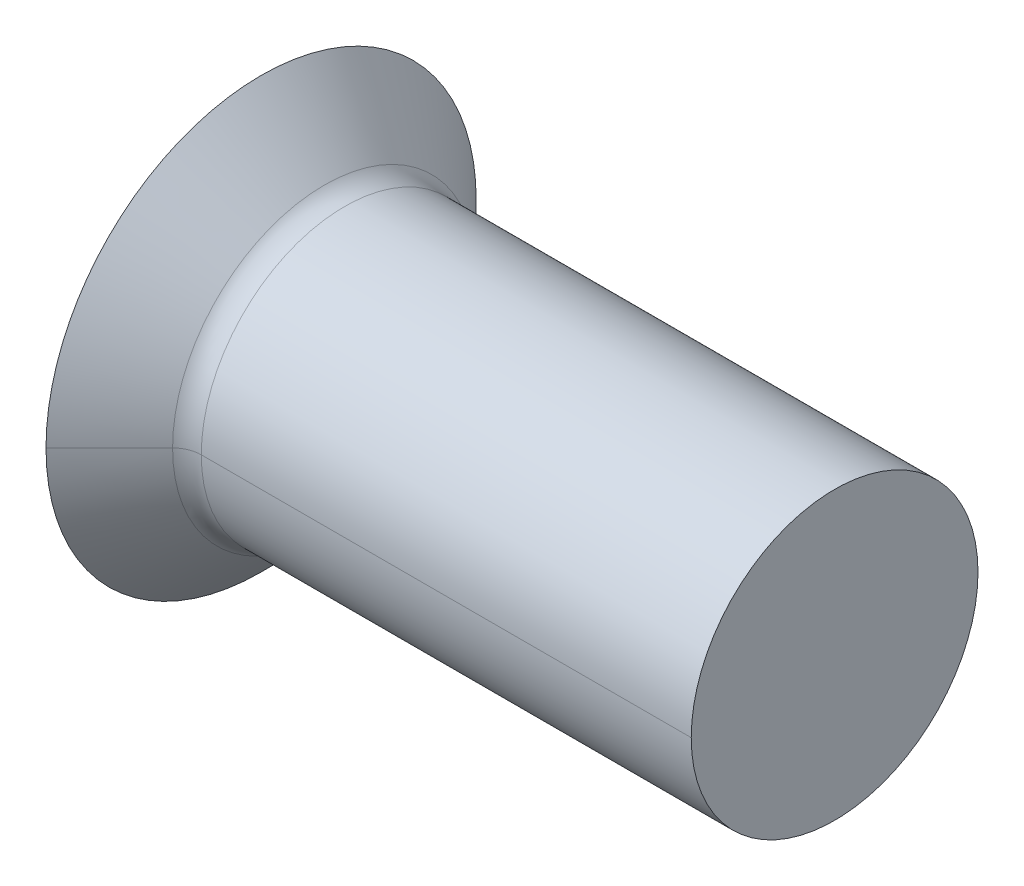
ISO-10303-21;
HEADER;
FILE_DESCRIPTION(('STEP AP214'),'2;1');
FILE_NAME('part.step','',(''),(''),'','','');
FILE_SCHEMA(('AUTOMOTIVE_DESIGN { 1 0 10303 214 1 1 1 1 }'));
ENDSEC;
DATA;
#1=APPLICATION_CONTEXT('core data for automotive mechanical design processes');
#2=APPLICATION_PROTOCOL_DEFINITION('international standard','automotive_design',2000,#1);
#3=PRODUCT_CONTEXT('',#1,'mechanical');
#4=PRODUCT('Part','Part','',(#3));
#5=PRODUCT_RELATED_PRODUCT_CATEGORY('part','',(#4));
#6=PRODUCT_DEFINITION_FORMATION('','',#4);
#7=PRODUCT_DEFINITION_CONTEXT('part definition',#1,'design');
#8=PRODUCT_DEFINITION('design','',#6,#7);
#9=PRODUCT_DEFINITION_SHAPE('','',#8);
#10=(LENGTH_UNIT() NAMED_UNIT(*) SI_UNIT(.MILLI.,.METRE.));
#11=(NAMED_UNIT(*) PLANE_ANGLE_UNIT() SI_UNIT($,.RADIAN.));
#12=(NAMED_UNIT(*) SI_UNIT($,.STERADIAN.) SOLID_ANGLE_UNIT());
#13=UNCERTAINTY_MEASURE_WITH_UNIT(LENGTH_MEASURE(1.E-05),#10,'distance_accuracy_value','');
#14=(GEOMETRIC_REPRESENTATION_CONTEXT(3) GLOBAL_UNCERTAINTY_ASSIGNED_CONTEXT((#13)) GLOBAL_UNIT_ASSIGNED_CONTEXT((#10,
#11,#12)) REPRESENTATION_CONTEXT('',''));
#15=CARTESIAN_POINT('',(0.,0.,0.));
#16=DIRECTION('',(0.,0.,1.));
#17=DIRECTION('',(1.,0.,0.));
#18=AXIS2_PLACEMENT_3D('',#15,#16,#17);
#19=CARTESIAN_POINT('',(0.582842712474624,0.,0.));
#20=DIRECTION('',(-1.,0.,0.));
#21=DIRECTION('',(0.,0.,1.));
#22=AXIS2_PLACEMENT_3D('',#19,#20,#21);
#23=TOROIDAL_SURFACE('',#22,1.2,0.2);
#24=CARTESIAN_POINT('',(0.441421356237315,0.,0.));
#25=DIRECTION('',(-1.,0.,0.));
#26=DIRECTION('',(0.,0.,1.));
#27=AXIS2_PLACEMENT_3D('',#24,#25,#26);
#28=CIRCLE('',#27,1.05857864376269);
#29=CARTESIAN_POINT('',(0.441421356237315,0.,-1.05857864376269));
#30=VERTEX_POINT('',#29);
#31=CARTESIAN_POINT('',(0.441421356237315,0.,1.05857864376269));
#32=VERTEX_POINT('',#31);
#33=EDGE_CURVE('E25',#30,#32,#28,.T.);
#34=ORIENTED_EDGE('',*,*,#33,.F.);
#35=CARTESIAN_POINT('',(0.582842712474624,0.,-1.2));
#36=DIRECTION('',(0.,1.,0.));
#37=DIRECTION('',(0.,0.,1.));
#38=AXIS2_PLACEMENT_3D('',#35,#36,#37);
#39=CIRCLE('',#38,0.2);
#40=CARTESIAN_POINT('',(0.582842712474624,0.,-1.));
#41=VERTEX_POINT('',#40);
#42=EDGE_CURVE('E172',#30,#41,#39,.T.);
#43=ORIENTED_EDGE('',*,*,#42,.T.);
#44=CARTESIAN_POINT('',(0.582842712474624,0.,0.));
#45=DIRECTION('',(1.,0.,0.));
#46=DIRECTION('',(0.,0.,1.));
#47=AXIS2_PLACEMENT_3D('',#44,#45,#46);
#48=CIRCLE('',#47,1.);
#49=CARTESIAN_POINT('',(0.582842712474624,0.,1.));
#50=VERTEX_POINT('',#49);
#51=EDGE_CURVE('E260',#50,#41,#48,.T.);
#52=ORIENTED_EDGE('',*,*,#51,.F.);
#53=CARTESIAN_POINT('',(0.582842712474624,0.,1.2));
#54=DIRECTION('',(0.,-1.,0.));
#55=DIRECTION('',(0.,0.,-1.));
#56=AXIS2_PLACEMENT_3D('',#53,#54,#55);
#57=CIRCLE('',#56,0.2);
#58=EDGE_CURVE('E246',#32,#50,#57,.T.);
#59=ORIENTED_EDGE('',*,*,#58,.F.);
#60=EDGE_LOOP('',(#34,#43,#52,#59));
#61=FACE_BOUND('',#60,.T.);
#62=ADVANCED_FACE('F17',(#61),#23,.F.);
#63=CARTESIAN_POINT('',(-6.50645201269087,0.,0.));
#64=DIRECTION('',(-1.,0.,0.));
#65=DIRECTION('',(0.,0.,1.));
#66=AXIS2_PLACEMENT_3D('',#63,#64,#65);
#67=CYLINDRICAL_SURFACE('',#66,1.);
#68=CARTESIAN_POINT('',(4.,0.,0.));
#69=DIRECTION('',(-1.,0.,0.));
#70=DIRECTION('',(0.,0.,1.));
#71=AXIS2_PLACEMENT_3D('',#68,#69,#70);
#72=CIRCLE('',#71,1.);
#73=CARTESIAN_POINT('',(4.,0.,1.));
#74=VERTEX_POINT('',#73);
#75=CARTESIAN_POINT('',(4.,0.,-1.));
#76=VERTEX_POINT('',#75);
#77=EDGE_CURVE('E263',#74,#76,#72,.T.);
#78=ORIENTED_EDGE('',*,*,#77,.T.);
#79=DIRECTION('',(-1.,0.,0.));
#80=VECTOR('',#79,1.);
#81=CARTESIAN_POINT('',(-6.50645201269087,0.,-1.));
#82=LINE('',#81,#80);
#83=EDGE_CURVE('E209',#76,#41,#82,.T.);
#84=ORIENTED_EDGE('',*,*,#83,.T.);
#85=CARTESIAN_POINT('',(0.582842712474624,0.,0.));
#86=DIRECTION('',(1.,0.,0.));
#87=DIRECTION('',(0.,0.,1.));
#88=AXIS2_PLACEMENT_3D('',#85,#86,#87);
#89=CIRCLE('',#88,1.);
#90=EDGE_CURVE('E214',#41,#50,#89,.T.);
#91=ORIENTED_EDGE('',*,*,#90,.T.);
#92=DIRECTION('',(-1.,0.,0.));
#93=VECTOR('',#92,1.);
#94=CARTESIAN_POINT('',(-6.50645201269087,0.,1.));
#95=LINE('',#94,#93);
#96=EDGE_CURVE('E256',#74,#50,#95,.T.);
#97=ORIENTED_EDGE('',*,*,#96,.F.);
#98=EDGE_LOOP('',(#78,#84,#91,#97));
#99=FACE_BOUND('',#98,.T.);
#100=ADVANCED_FACE('F300',(#99),#67,.T.);
#101=CARTESIAN_POINT('',(0.500000000000006,0.,0.));
#102=DIRECTION('',(-1.,0.,0.));
#103=DIRECTION('',(0.,0.,1.));
#104=AXIS2_PLACEMENT_3D('',#101,#102,#103);
#105=CONICAL_SURFACE('',#104,1.,0.785398163397442);
#106=CARTESIAN_POINT('',(0.441421356237315,0.,0.));
#107=DIRECTION('',(-1.,0.,0.));
#108=DIRECTION('',(0.,0.,1.));
#109=AXIS2_PLACEMENT_3D('',#106,#107,#108);
#110=CIRCLE('',#109,1.05857864376269);
#111=EDGE_CURVE('E176',#32,#30,#110,.T.);
#112=ORIENTED_EDGE('',*,*,#111,.T.);
#113=DIRECTION('',(-0.707106781186552,0.,-0.707106781186544));
#114=VECTOR('',#113,1.);
#115=CARTESIAN_POINT('',(0.500000000000006,0.,-1.));
#116=LINE('',#115,#114);
#117=CARTESIAN_POINT('',(0.,0.,-1.5));
#118=VERTEX_POINT('',#117);
#119=EDGE_CURVE('E38',#30,#118,#116,.T.);
#120=ORIENTED_EDGE('',*,*,#119,.T.);
#121=CARTESIAN_POINT('',(0.,0.,0.));
#122=DIRECTION('',(-1.,0.,0.));
#123=DIRECTION('',(0.,0.,1.));
#124=AXIS2_PLACEMENT_3D('',#121,#122,#123);
#125=CIRCLE('',#124,1.5);
#126=CARTESIAN_POINT('',(0.,0.,1.5));
#127=VERTEX_POINT('',#126);
#128=EDGE_CURVE('E266',#127,#118,#125,.T.);
#129=ORIENTED_EDGE('',*,*,#128,.F.);
#130=DIRECTION('',(-0.707106781186552,0.,0.707106781186544));
#131=VECTOR('',#130,1.);
#132=CARTESIAN_POINT('',(0.500000000000006,0.,1.));
#133=LINE('',#132,#131);
#134=EDGE_CURVE('E11',#32,#127,#133,.T.);
#135=ORIENTED_EDGE('',*,*,#134,.F.);
#136=EDGE_LOOP('',(#112,#120,#129,#135));
#137=FACE_BOUND('',#136,.T.);
#138=ADVANCED_FACE('F285',(#137),#105,.T.);
#139=CARTESIAN_POINT('',(0.500000000000006,0.,0.));
#140=DIRECTION('',(-1.,0.,0.));
#141=DIRECTION('',(0.,0.,1.));
#142=AXIS2_PLACEMENT_3D('',#139,#140,#141);
#143=CONICAL_SURFACE('',#142,1.,0.785398163397442);
#144=ORIENTED_EDGE('',*,*,#119,.F.);
#145=ORIENTED_EDGE('',*,*,#33,.T.);
#146=ORIENTED_EDGE('',*,*,#134,.T.);
#147=CARTESIAN_POINT('',(0.,0.,0.));
#148=DIRECTION('',(-1.,0.,0.));
#149=DIRECTION('',(0.,0.,1.));
#150=AXIS2_PLACEMENT_3D('',#147,#148,#149);
#151=CIRCLE('',#150,1.5);
#152=EDGE_CURVE('E270',#118,#127,#151,.T.);
#153=ORIENTED_EDGE('',*,*,#152,.F.);
#154=EDGE_LOOP('',(#144,#145,#146,#153));
#155=FACE_BOUND('',#154,.T.);
#156=ADVANCED_FACE('F278',(#155),#143,.T.);
#157=CARTESIAN_POINT('',(0.,0.,-1.5));
#158=DIRECTION('',(1.,0.,0.));
#159=DIRECTION('',(0.,1.,0.));
#160=AXIS2_PLACEMENT_3D('',#157,#158,#159);
#161=PLANE('',#160);
#162=DIRECTION('',(0.,0.,-1.));
#163=VECTOR('',#162,1.);
#164=CARTESIAN_POINT('',(0.,0.2,-0.25));
#165=LINE('',#164,#163);
#166=CARTESIAN_POINT('',(0.,0.2,-0.25));
#167=VERTEX_POINT('',#166);
#168=CARTESIAN_POINT('',(0.,0.2,-1.25));
#169=VERTEX_POINT('',#168);
#170=EDGE_CURVE('E128',#167,#169,#165,.T.);
#171=ORIENTED_EDGE('',*,*,#170,.F.);
#172=DIRECTION('',(0.,-1.,0.));
#173=VECTOR('',#172,1.);
#174=CARTESIAN_POINT('',(0.,0.2,-0.25));
#175=LINE('',#174,#173);
#176=CARTESIAN_POINT('',(0.,1.25,-0.25));
#177=VERTEX_POINT('',#176);
#178=EDGE_CURVE('E136',#177,#167,#175,.T.);
#179=ORIENTED_EDGE('',*,*,#178,.F.);
#180=DIRECTION('',(0.,0.,-1.));
#181=VECTOR('',#180,1.);
#182=CARTESIAN_POINT('',(0.,1.25,0.25));
#183=LINE('',#182,#181);
#184=CARTESIAN_POINT('',(0.,1.25,0.25));
#185=VERTEX_POINT('',#184);
#186=EDGE_CURVE('E232',#185,#177,#183,.T.);
#187=ORIENTED_EDGE('',*,*,#186,.F.);
#188=DIRECTION('',(0.,1.,0.));
#189=VECTOR('',#188,1.);
#190=CARTESIAN_POINT('',(0.,0.2,0.25));
#191=LINE('',#190,#189);
#192=CARTESIAN_POINT('',(0.,0.2,0.25));
#193=VERTEX_POINT('',#192);
#194=EDGE_CURVE('E224',#193,#185,#191,.T.);
#195=ORIENTED_EDGE('',*,*,#194,.F.);
#196=DIRECTION('',(0.,0.,-1.));
#197=VECTOR('',#196,1.);
#198=CARTESIAN_POINT('',(0.,0.2,1.25));
#199=LINE('',#198,#197);
#200=CARTESIAN_POINT('',(0.,0.2,1.25));
#201=VERTEX_POINT('',#200);
#202=EDGE_CURVE('E187',#201,#193,#199,.T.);
#203=ORIENTED_EDGE('',*,*,#202,.F.);
#204=DIRECTION('',(0.,1.,0.));
#205=VECTOR('',#204,1.);
#206=CARTESIAN_POINT('',(0.,0.2,1.25));
#207=LINE('',#206,#205);
#208=CARTESIAN_POINT('',(0.,-0.2,1.25));
#209=VERTEX_POINT('',#208);
#210=EDGE_CURVE('E200',#209,#201,#207,.T.);
#211=ORIENTED_EDGE('',*,*,#210,.F.);
#212=DIRECTION('',(0.,0.,1.));
#213=VECTOR('',#212,1.);
#214=CARTESIAN_POINT('',(0.,-0.2,1.25));
#215=LINE('',#214,#213);
#216=CARTESIAN_POINT('',(0.,-0.2,0.25));
#217=VERTEX_POINT('',#216);
#218=EDGE_CURVE('E204',#217,#209,#215,.T.);
#219=ORIENTED_EDGE('',*,*,#218,.F.);
#220=DIRECTION('',(0.,1.,0.));
#221=VECTOR('',#220,1.);
#222=CARTESIAN_POINT('',(0.,-1.25,0.25));
#223=LINE('',#222,#221);
#224=CARTESIAN_POINT('',(0.,-1.25,0.25));
#225=VERTEX_POINT('',#224);
#226=EDGE_CURVE('E168',#225,#217,#223,.T.);
#227=ORIENTED_EDGE('',*,*,#226,.F.);
#228=DIRECTION('',(0.,0.,1.));
#229=VECTOR('',#228,1.);
#230=CARTESIAN_POINT('',(0.,-1.25,0.25));
#231=LINE('',#230,#229);
#232=CARTESIAN_POINT('',(0.,-1.25,-0.25));
#233=VERTEX_POINT('',#232);
#234=EDGE_CURVE('E169',#233,#225,#231,.T.);
#235=ORIENTED_EDGE('',*,*,#234,.F.);
#236=DIRECTION('',(0.,-1.,0.));
#237=VECTOR('',#236,1.);
#238=CARTESIAN_POINT('',(0.,-1.25,-0.25));
#239=LINE('',#238,#237);
#240=CARTESIAN_POINT('',(0.,-0.2,-0.25));
#241=VERTEX_POINT('',#240);
#242=EDGE_CURVE('E160',#241,#233,#239,.T.);
#243=ORIENTED_EDGE('',*,*,#242,.F.);
#244=DIRECTION('',(0.,0.,1.));
#245=VECTOR('',#244,1.);
#246=CARTESIAN_POINT('',(0.,-0.2,-0.25));
#247=LINE('',#246,#245);
#248=CARTESIAN_POINT('',(0.,-0.2,-1.25));
#249=VERTEX_POINT('',#248);
#250=EDGE_CURVE('E143',#249,#241,#247,.T.);
#251=ORIENTED_EDGE('',*,*,#250,.F.);
#252=DIRECTION('',(0.,-1.,0.));
#253=VECTOR('',#252,1.);
#254=CARTESIAN_POINT('',(0.,0.2,-1.25));
#255=LINE('',#254,#253);
#256=EDGE_CURVE('E139',#169,#249,#255,.T.);
#257=ORIENTED_EDGE('',*,*,#256,.F.);
#258=EDGE_LOOP('',(#171,#179,#187,#195,#203,#211,#219,#227,#235,#243,#251,#257));
#259=FACE_BOUND('',#258,.T.);
#260=ORIENTED_EDGE('',*,*,#128,.T.);
#261=ORIENTED_EDGE('',*,*,#152,.T.);
#262=EDGE_LOOP('',(#260,#261));
#263=FACE_BOUND('',#262,.T.);
#264=ADVANCED_FACE('F140',(#259,#263),#161,.F.);
#265=CARTESIAN_POINT('',(4.,0.,-1.));
#266=DIRECTION('',(-1.,0.,0.));
#267=DIRECTION('',(0.,0.,1.));
#268=AXIS2_PLACEMENT_3D('',#265,#266,#267);
#269=PLANE('',#268);
#270=ORIENTED_EDGE('',*,*,#77,.F.);
#271=CARTESIAN_POINT('',(4.,0.,0.));
#272=DIRECTION('',(-1.,0.,0.));
#273=DIRECTION('',(0.,0.,1.));
#274=AXIS2_PLACEMENT_3D('',#271,#272,#273);
#275=CIRCLE('',#274,1.);
#276=EDGE_CURVE('E213',#76,#74,#275,.T.);
#277=ORIENTED_EDGE('',*,*,#276,.F.);
#278=EDGE_LOOP('',(#270,#277));
#279=FACE_BOUND('',#278,.T.);
#280=ADVANCED_FACE('F287',(#279),#269,.F.);
#281=CARTESIAN_POINT('',(-6.50645201269087,0.,0.));
#282=DIRECTION('',(-1.,0.,0.));
#283=DIRECTION('',(0.,0.,1.));
#284=AXIS2_PLACEMENT_3D('',#281,#282,#283);
#285=CYLINDRICAL_SURFACE('',#284,1.);
#286=ORIENTED_EDGE('',*,*,#83,.F.);
#287=ORIENTED_EDGE('',*,*,#276,.T.);
#288=ORIENTED_EDGE('',*,*,#96,.T.);
#289=ORIENTED_EDGE('',*,*,#51,.T.);
#290=EDGE_LOOP('',(#286,#287,#288,#289));
#291=FACE_BOUND('',#290,.T.);
#292=ADVANCED_FACE('F295',(#291),#285,.T.);
#293=CARTESIAN_POINT('',(0.582842712474624,0.,0.));
#294=DIRECTION('',(-1.,0.,0.));
#295=DIRECTION('',(0.,0.,1.));
#296=AXIS2_PLACEMENT_3D('',#293,#294,#295);
#297=TOROIDAL_SURFACE('',#296,1.2,0.2);
#298=ORIENTED_EDGE('',*,*,#42,.F.);
#299=ORIENTED_EDGE('',*,*,#111,.F.);
#300=ORIENTED_EDGE('',*,*,#58,.T.);
#301=ORIENTED_EDGE('',*,*,#90,.F.);
#302=EDGE_LOOP('',(#298,#299,#300,#301));
#303=FACE_BOUND('',#302,.T.);
#304=ADVANCED_FACE('F284',(#303),#297,.F.);
#305=CARTESIAN_POINT('',(0.,1.25,-0.25));
#306=DIRECTION('',(0.127164315985366,0.,-0.991881664685851));
#307=DIRECTION('',(0.,-1.,0.));
#308=AXIS2_PLACEMENT_3D('',#305,#306,#307);
#309=PLANE('',#308);
#310=DIRECTION('',(0.837017802914137,-0.536549873662909,0.107309974732582));
#311=VECTOR('',#310,1.);
#312=CARTESIAN_POINT('',(0.,1.25,-0.25));
#313=LINE('',#312,#311);
#314=CARTESIAN_POINT('',(1.95,0.,0.));
#315=VERTEX_POINT('',#314);
#316=EDGE_CURVE('E236',#177,#315,#313,.T.);
#317=ORIENTED_EDGE('',*,*,#316,.F.);
#318=ORIENTED_EDGE('',*,*,#178,.T.);
#319=DIRECTION('',(0.986788528770052,-0.101209079873851,0.126511349842314));
#320=VECTOR('',#319,1.);
#321=CARTESIAN_POINT('',(0.,0.2,-0.25));
#322=LINE('',#321,#320);
#323=EDGE_CURVE('E133',#167,#315,#322,.T.);
#324=ORIENTED_EDGE('',*,*,#323,.T.);
#325=EDGE_LOOP('',(#317,#318,#324));
#326=FACE_BOUND('',#325,.T.);
#327=ADVANCED_FACE('F321',(#326),#309,.F.);
#328=CARTESIAN_POINT('',(0.,0.2,-0.25));
#329=DIRECTION('',(0.102028865498569,0.994781438611052,0.));
#330=DIRECTION('',(0.,0.,-1.));
#331=AXIS2_PLACEMENT_3D('',#328,#329,#330);
#332=PLANE('',#331);
#333=ORIENTED_EDGE('',*,*,#323,.F.);
#334=ORIENTED_EDGE('',*,*,#170,.T.);
#335=DIRECTION('',(0.838758167557713,-0.0860264787238682,0.537665492024176));
#336=VECTOR('',#335,1.);
#337=CARTESIAN_POINT('',(0.,0.2,-1.25));
#338=LINE('',#337,#336);
#339=EDGE_CURVE('E132',#169,#315,#338,.T.);
#340=ORIENTED_EDGE('',*,*,#339,.T.);
#341=EDGE_LOOP('',(#333,#334,#340));
#342=FACE_BOUND('',#341,.T.);
#343=ADVANCED_FACE('F130',(#342),#332,.F.);
#344=CARTESIAN_POINT('',(0.,1.25,0.25));
#345=DIRECTION('',(0.539666114720432,0.841879138963874,0.));
#346=DIRECTION('',(0.,0.,-1.));
#347=AXIS2_PLACEMENT_3D('',#344,#345,#346);
#348=PLANE('',#347);
#349=DIRECTION('',(0.837017802914137,-0.536549873662909,-0.107309974732582));
#350=VECTOR('',#349,1.);
#351=CARTESIAN_POINT('',(0.,1.25,0.25));
#352=LINE('',#351,#350);
#353=EDGE_CURVE('E228',#185,#315,#352,.T.);
#354=ORIENTED_EDGE('',*,*,#353,.F.);
#355=ORIENTED_EDGE('',*,*,#186,.T.);
#356=ORIENTED_EDGE('',*,*,#316,.T.);
#357=EDGE_LOOP('',(#354,#355,#356));
#358=FACE_BOUND('',#357,.T.);
#359=ADVANCED_FACE('F327',(#358),#348,.F.);
#360=CARTESIAN_POINT('',(0.,0.2,0.25));
#361=DIRECTION('',(0.127164315985366,0.,0.991881664685851));
#362=DIRECTION('',(0.,-1.,0.));
#363=AXIS2_PLACEMENT_3D('',#360,#361,#362);
#364=PLANE('',#363);
#365=DIRECTION('',(0.986788528770052,-0.101209079873851,-0.126511349842314));
#366=VECTOR('',#365,1.);
#367=CARTESIAN_POINT('',(0.,0.2,0.25));
#368=LINE('',#367,#366);
#369=EDGE_CURVE('E191',#193,#315,#368,.T.);
#370=ORIENTED_EDGE('',*,*,#369,.F.);
#371=ORIENTED_EDGE('',*,*,#194,.T.);
#372=ORIENTED_EDGE('',*,*,#353,.T.);
#373=EDGE_LOOP('',(#370,#371,#372));
#374=FACE_BOUND('',#373,.T.);
#375=ADVANCED_FACE('F330',(#374),#364,.F.);
#376=CARTESIAN_POINT('',(0.,0.2,1.25));
#377=DIRECTION('',(0.102028865498569,0.994781438611052,0.));
#378=DIRECTION('',(0.,0.,-1.));
#379=AXIS2_PLACEMENT_3D('',#376,#377,#378);
#380=PLANE('',#379);
#381=DIRECTION('',(0.838758167557713,-0.0860264787238683,-0.537665492024176));
#382=VECTOR('',#381,1.);
#383=CARTESIAN_POINT('',(0.,0.2,1.25));
#384=LINE('',#383,#382);
#385=EDGE_CURVE('E192',#201,#315,#384,.T.);
#386=ORIENTED_EDGE('',*,*,#385,.F.);
#387=ORIENTED_EDGE('',*,*,#202,.T.);
#388=ORIENTED_EDGE('',*,*,#369,.T.);
#389=EDGE_LOOP('',(#386,#387,#388));
#390=FACE_BOUND('',#389,.T.);
#391=ADVANCED_FACE('F334',(#390),#380,.F.);
#392=CARTESIAN_POINT('',(0.,-0.2,1.25));
#393=DIRECTION('',(0.539666114720432,0.,0.841879138963874));
#394=DIRECTION('',(0.,-1.,0.));
#395=AXIS2_PLACEMENT_3D('',#392,#393,#394);
#396=PLANE('',#395);
#397=DIRECTION('',(0.838758167557713,0.0860264787238683,-0.537665492024176));
#398=VECTOR('',#397,1.);
#399=CARTESIAN_POINT('',(0.,-0.2,1.25));
#400=LINE('',#399,#398);
#401=EDGE_CURVE('E208',#209,#315,#400,.T.);
#402=ORIENTED_EDGE('',*,*,#401,.F.);
#403=ORIENTED_EDGE('',*,*,#210,.T.);
#404=ORIENTED_EDGE('',*,*,#385,.T.);
#405=EDGE_LOOP('',(#402,#403,#404));
#406=FACE_BOUND('',#405,.T.);
#407=ADVANCED_FACE('F325',(#406),#396,.F.);
#408=CARTESIAN_POINT('',(0.,-0.2,0.25));
#409=DIRECTION('',(0.102028865498569,-0.994781438611052,0.));
#410=DIRECTION('',(0.,0.,-1.));
#411=AXIS2_PLACEMENT_3D('',#408,#409,#410);
#412=PLANE('',#411);
#413=DIRECTION('',(0.986788528770052,0.101209079873851,-0.126511349842314));
#414=VECTOR('',#413,1.);
#415=CARTESIAN_POINT('',(0.,-0.2,0.25));
#416=LINE('',#415,#414);
#417=EDGE_CURVE('E196',#217,#315,#416,.T.);
#418=ORIENTED_EDGE('',*,*,#417,.F.);
#419=ORIENTED_EDGE('',*,*,#218,.T.);
#420=ORIENTED_EDGE('',*,*,#401,.T.);
#421=EDGE_LOOP('',(#418,#419,#420));
#422=FACE_BOUND('',#421,.T.);
#423=ADVANCED_FACE('F352',(#422),#412,.F.);
#424=CARTESIAN_POINT('',(0.,-1.25,0.25));
#425=DIRECTION('',(0.127164315985366,0.,0.991881664685851));
#426=DIRECTION('',(0.,-1.,0.));
#427=AXIS2_PLACEMENT_3D('',#424,#425,#426);
#428=PLANE('',#427);
#429=DIRECTION('',(0.837017802914137,0.536549873662909,-0.107309974732582));
#430=VECTOR('',#429,1.);
#431=CARTESIAN_POINT('',(0.,-1.25,0.25));
#432=LINE('',#431,#430);
#433=EDGE_CURVE('E164',#225,#315,#432,.T.);
#434=ORIENTED_EDGE('',*,*,#433,.F.);
#435=ORIENTED_EDGE('',*,*,#226,.T.);
#436=ORIENTED_EDGE('',*,*,#417,.T.);
#437=EDGE_LOOP('',(#434,#435,#436));
#438=FACE_BOUND('',#437,.T.);
#439=ADVANCED_FACE('F354',(#438),#428,.F.);
#440=CARTESIAN_POINT('',(0.,-1.25,-0.25));
#441=DIRECTION('',(0.539666114720432,-0.841879138963874,0.));
#442=DIRECTION('',(0.,0.,-1.));
#443=AXIS2_PLACEMENT_3D('',#440,#441,#442);
#444=PLANE('',#443);
#445=DIRECTION('',(0.837017802914137,0.536549873662909,0.107309974732582));
#446=VECTOR('',#445,1.);
#447=CARTESIAN_POINT('',(0.,-1.25,-0.25));
#448=LINE('',#447,#446);
#449=EDGE_CURVE('E180',#233,#315,#448,.T.);
#450=ORIENTED_EDGE('',*,*,#449,.F.);
#451=ORIENTED_EDGE('',*,*,#234,.T.);
#452=ORIENTED_EDGE('',*,*,#433,.T.);
#453=EDGE_LOOP('',(#450,#451,#452));
#454=FACE_BOUND('',#453,.T.);
#455=ADVANCED_FACE('F357',(#454),#444,.F.);
#456=CARTESIAN_POINT('',(0.,-0.2,-0.25));
#457=DIRECTION('',(0.127164315985366,0.,-0.991881664685851));
#458=DIRECTION('',(0.,-1.,0.));
#459=AXIS2_PLACEMENT_3D('',#456,#457,#458);
#460=PLANE('',#459);
#461=DIRECTION('',(0.986788528770052,0.101209079873851,0.126511349842314));
#462=VECTOR('',#461,1.);
#463=CARTESIAN_POINT('',(0.,-0.2,-0.25));
#464=LINE('',#463,#462);
#465=EDGE_CURVE('E157',#241,#315,#464,.T.);
#466=ORIENTED_EDGE('',*,*,#465,.F.);
#467=ORIENTED_EDGE('',*,*,#242,.T.);
#468=ORIENTED_EDGE('',*,*,#449,.T.);
#469=EDGE_LOOP('',(#466,#467,#468));
#470=FACE_BOUND('',#469,.T.);
#471=ADVANCED_FACE('F360',(#470),#460,.F.);
#472=CARTESIAN_POINT('',(0.,-0.2,-1.25));
#473=DIRECTION('',(0.102028865498569,-0.994781438611052,0.));
#474=DIRECTION('',(0.,0.,-1.));
#475=AXIS2_PLACEMENT_3D('',#472,#473,#474);
#476=PLANE('',#475);
#477=DIRECTION('',(0.838758167557713,0.0860264787238679,0.537665492024176));
#478=VECTOR('',#477,1.);
#479=CARTESIAN_POINT('',(0.,-0.2,-1.25));
#480=LINE('',#479,#478);
#481=EDGE_CURVE('E148',#249,#315,#480,.T.);
#482=ORIENTED_EDGE('',*,*,#481,.F.);
#483=ORIENTED_EDGE('',*,*,#250,.T.);
#484=ORIENTED_EDGE('',*,*,#465,.T.);
#485=EDGE_LOOP('',(#482,#483,#484));
#486=FACE_BOUND('',#485,.T.);
#487=ADVANCED_FACE('F362',(#486),#476,.F.);
#488=CARTESIAN_POINT('',(0.,0.2,-1.25));
#489=DIRECTION('',(0.539666114720432,0.,-0.841879138963874));
#490=DIRECTION('',(0.,-1.,0.));
#491=AXIS2_PLACEMENT_3D('',#488,#489,#490);
#492=PLANE('',#491);
#493=ORIENTED_EDGE('',*,*,#339,.F.);
#494=ORIENTED_EDGE('',*,*,#256,.T.);
#495=ORIENTED_EDGE('',*,*,#481,.T.);
#496=EDGE_LOOP('',(#493,#494,#495));
#497=FACE_BOUND('',#496,.T.);
#498=ADVANCED_FACE('F150',(#497),#492,.F.);
#499=CLOSED_SHELL('',(#62,#100,#138,#156,#264,#280,#292,#304,#327,#343,#359,#375,#391,#407,#423,
#439,#455,#471,#487,#498));
#500=MANIFOLD_SOLID_BREP('B1',#499);
#501=ADVANCED_BREP_SHAPE_REPRESENTATION('',(#18,#500),#14);
#502=SHAPE_DEFINITION_REPRESENTATION(#9,#501);
ENDSEC;
END-ISO-10303-21;
